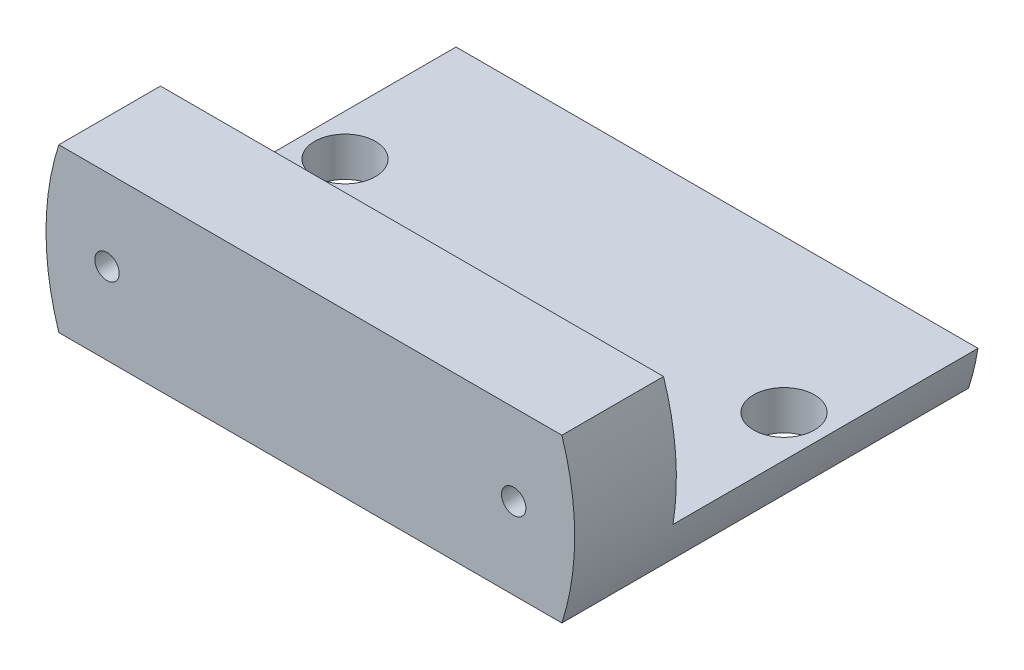
ISO-10303-21;
HEADER;
FILE_DESCRIPTION(('STEP AP214'),'2;1');
FILE_NAME('part.step','',(''),(''),'','','');
FILE_SCHEMA(('AUTOMOTIVE_DESIGN { 1 0 10303 214 1 1 1 1 }'));
ENDSEC;
DATA;
#1=APPLICATION_CONTEXT('core data for automotive mechanical design processes');
#2=APPLICATION_PROTOCOL_DEFINITION('international standard','automotive_design',2000,#1);
#3=PRODUCT_CONTEXT('',#1,'mechanical');
#4=PRODUCT('Part','Part','',(#3));
#5=PRODUCT_RELATED_PRODUCT_CATEGORY('part','',(#4));
#6=PRODUCT_DEFINITION_FORMATION('','',#4);
#7=PRODUCT_DEFINITION_CONTEXT('part definition',#1,'design');
#8=PRODUCT_DEFINITION('design','',#6,#7);
#9=PRODUCT_DEFINITION_SHAPE('','',#8);
#10=(LENGTH_UNIT() NAMED_UNIT(*) SI_UNIT(.MILLI.,.METRE.));
#11=(NAMED_UNIT(*) PLANE_ANGLE_UNIT() SI_UNIT($,.RADIAN.));
#12=(NAMED_UNIT(*) SI_UNIT($,.STERADIAN.) SOLID_ANGLE_UNIT());
#13=UNCERTAINTY_MEASURE_WITH_UNIT(LENGTH_MEASURE(1.E-05),#10,'distance_accuracy_value','');
#14=(GEOMETRIC_REPRESENTATION_CONTEXT(3) GLOBAL_UNCERTAINTY_ASSIGNED_CONTEXT((#13)) GLOBAL_UNIT_ASSIGNED_CONTEXT((#10,
#11,#12)) REPRESENTATION_CONTEXT('',''));
#15=CARTESIAN_POINT('',(0.,0.,0.));
#16=DIRECTION('',(0.,0.,1.));
#17=DIRECTION('',(1.,0.,0.));
#18=AXIS2_PLACEMENT_3D('',#15,#16,#17);
#19=CARTESIAN_POINT('',(0.,0.,0.));
#20=DIRECTION('',(0.,0.,1.));
#21=DIRECTION('',(1.,0.,0.));
#22=AXIS2_PLACEMENT_3D('',#19,#20,#21);
#23=PLANE('',#22);
#24=CARTESIAN_POINT('',(-10.,0.,0.));
#25=DIRECTION('',(0.,0.,1.));
#26=DIRECTION('',(-1.,0.,0.));
#27=AXIS2_PLACEMENT_3D('',#24,#25,#26);
#28=CIRCLE('',#27,0.6);
#29=CARTESIAN_POINT('',(-10.6,0.,0.));
#30=VERTEX_POINT('',#29);
#31=EDGE_CURVE('E114',#30,#30,#28,.T.);
#32=ORIENTED_EDGE('',*,*,#31,.T.);
#33=EDGE_LOOP('',(#32));
#34=FACE_BOUND('',#33,.T.);
#35=CARTESIAN_POINT('',(10.,0.,0.));
#36=DIRECTION('',(0.,0.,1.));
#37=DIRECTION('',(1.,0.,0.));
#38=AXIS2_PLACEMENT_3D('',#35,#36,#37);
#39=CIRCLE('',#38,0.6);
#40=CARTESIAN_POINT('',(10.6,0.,0.));
#41=VERTEX_POINT('',#40);
#42=EDGE_CURVE('E144',#41,#41,#39,.T.);
#43=ORIENTED_EDGE('',*,*,#42,.T.);
#44=EDGE_LOOP('',(#43));
#45=FACE_BOUND('',#44,.T.);
#46=DIRECTION('',(1.,0.,0.));
#47=VECTOR('',#46,1.);
#48=CARTESIAN_POINT('',(12.3275902603068,-2.06894136552694,0.));
#49=LINE('',#48,#47);
#50=CARTESIAN_POINT('',(-12.8343087708693,-2.06894136552694,0.));
#51=VERTEX_POINT('',#50);
#52=CARTESIAN_POINT('',(12.8343087708693,-2.06894136552694,0.));
#53=VERTEX_POINT('',#52);
#54=EDGE_CURVE('E50',#51,#53,#49,.T.);
#55=ORIENTED_EDGE('',*,*,#54,.F.);
#56=CARTESIAN_POINT('',(0.,0.,0.));
#57=DIRECTION('',(0.,0.,1.));
#58=DIRECTION('',(1.,0.,0.));
#59=AXIS2_PLACEMENT_3D('',#56,#57,#58);
#60=CIRCLE('',#59,13.);
#61=CARTESIAN_POINT('',(-12.369316876853,4.,0.));
#62=VERTEX_POINT('',#61);
#63=EDGE_CURVE('E139',#62,#51,#60,.T.);
#64=ORIENTED_EDGE('',*,*,#63,.F.);
#65=DIRECTION('',(-1.,0.,0.));
#66=VECTOR('',#65,1.);
#67=CARTESIAN_POINT('',(-11.842719282327,4.,0.));
#68=LINE('',#67,#66);
#69=CARTESIAN_POINT('',(12.369316876853,4.,0.));
#70=VERTEX_POINT('',#69);
#71=EDGE_CURVE('E74',#70,#62,#68,.T.);
#72=ORIENTED_EDGE('',*,*,#71,.F.);
#73=CARTESIAN_POINT('',(0.,0.,0.));
#74=DIRECTION('',(0.,0.,1.));
#75=DIRECTION('',(1.,0.,0.));
#76=AXIS2_PLACEMENT_3D('',#73,#74,#75);
#77=CIRCLE('',#76,13.);
#78=EDGE_CURVE('E132',#53,#70,#77,.T.);
#79=ORIENTED_EDGE('',*,*,#78,.F.);
#80=EDGE_LOOP('',(#55,#64,#72,#79));
#81=FACE_BOUND('',#80,.T.);
#82=ADVANCED_FACE('F33',(#34,#45,#81),#23,.F.);
#83=CARTESIAN_POINT('',(0.,0.,5.));
#84=DIRECTION('',(0.,0.,1.));
#85=DIRECTION('',(1.,0.,0.));
#86=AXIS2_PLACEMENT_3D('',#83,#84,#85);
#87=PLANE('',#86);
#88=CARTESIAN_POINT('',(10.,0.,5.));
#89=DIRECTION('',(0.,0.,1.));
#90=DIRECTION('',(1.,0.,0.));
#91=AXIS2_PLACEMENT_3D('',#88,#89,#90);
#92=CIRCLE('',#91,0.6);
#93=CARTESIAN_POINT('',(10.6,0.,5.));
#94=VERTEX_POINT('',#93);
#95=EDGE_CURVE('E142',#94,#94,#92,.T.);
#96=ORIENTED_EDGE('',*,*,#95,.F.);
#97=EDGE_LOOP('',(#96));
#98=FACE_BOUND('',#97,.T.);
#99=CARTESIAN_POINT('',(0.,0.,5.));
#100=DIRECTION('',(0.,0.,1.));
#101=DIRECTION('',(1.,0.,0.));
#102=AXIS2_PLACEMENT_3D('',#99,#100,#101);
#103=CIRCLE('',#102,13.);
#104=CARTESIAN_POINT('',(-12.369316876853,4.,5.));
#105=VERTEX_POINT('',#104);
#106=CARTESIAN_POINT('',(-12.369316876853,-3.99999999999999,5.));
#107=VERTEX_POINT('',#106);
#108=EDGE_CURVE('E154',#105,#107,#103,.T.);
#109=ORIENTED_EDGE('',*,*,#108,.T.);
#110=DIRECTION('',(1.,0.,0.));
#111=VECTOR('',#110,1.);
#112=CARTESIAN_POINT('',(-11.842719282327,-3.99999999999999,5.));
#113=LINE('',#112,#111);
#114=CARTESIAN_POINT('',(12.369316876853,-4.,5.));
#115=VERTEX_POINT('',#114);
#116=EDGE_CURVE('E81',#107,#115,#113,.T.);
#117=ORIENTED_EDGE('',*,*,#116,.T.);
#118=CARTESIAN_POINT('',(0.,0.,5.));
#119=DIRECTION('',(0.,0.,1.));
#120=DIRECTION('',(1.,0.,0.));
#121=AXIS2_PLACEMENT_3D('',#118,#119,#120);
#122=CIRCLE('',#121,13.);
#123=CARTESIAN_POINT('',(12.369316876853,4.,5.));
#124=VERTEX_POINT('',#123);
#125=EDGE_CURVE('E159',#115,#124,#122,.T.);
#126=ORIENTED_EDGE('',*,*,#125,.T.);
#127=DIRECTION('',(-1.,0.,0.));
#128=VECTOR('',#127,1.);
#129=CARTESIAN_POINT('',(11.842719282327,4.,5.));
#130=LINE('',#129,#128);
#131=EDGE_CURVE('E59',#124,#105,#130,.T.);
#132=ORIENTED_EDGE('',*,*,#131,.T.);
#133=EDGE_LOOP('',(#109,#117,#126,#132));
#134=FACE_BOUND('',#133,.T.);
#135=CARTESIAN_POINT('',(-10.,0.,5.));
#136=DIRECTION('',(0.,0.,1.));
#137=DIRECTION('',(-1.,0.,0.));
#138=AXIS2_PLACEMENT_3D('',#135,#136,#137);
#139=CIRCLE('',#138,0.6);
#140=CARTESIAN_POINT('',(-10.6,0.,5.));
#141=VERTEX_POINT('',#140);
#142=EDGE_CURVE('E127',#141,#141,#139,.T.);
#143=ORIENTED_EDGE('',*,*,#142,.F.);
#144=EDGE_LOOP('',(#143));
#145=FACE_BOUND('',#144,.T.);
#146=ADVANCED_FACE('F161',(#98,#134,#145),#87,.T.);
#147=CARTESIAN_POINT('',(0.,0.,5.));
#148=DIRECTION('',(0.,0.,-1.));
#149=DIRECTION('',(-1.,0.,0.));
#150=AXIS2_PLACEMENT_3D('',#147,#148,#149);
#151=CYLINDRICAL_SURFACE('',#150,13.);
#152=ORIENTED_EDGE('',*,*,#63,.T.);
#153=DIRECTION('',(0.,0.,1.));
#154=VECTOR('',#153,1.);
#155=CARTESIAN_POINT('',(-12.8343087708693,-2.06894136552695,-15.));
#156=LINE('',#155,#154);
#157=CARTESIAN_POINT('',(-12.8343087708693,-2.06894136552695,-15.));
#158=VERTEX_POINT('',#157);
#159=EDGE_CURVE('E115',#158,#51,#156,.T.);
#160=ORIENTED_EDGE('',*,*,#159,.F.);
#161=CARTESIAN_POINT('',(0.,0.,-15.));
#162=DIRECTION('',(0.,0.,-1.));
#163=DIRECTION('',(-1.,0.,0.));
#164=AXIS2_PLACEMENT_3D('',#161,#162,#163);
#165=CIRCLE('',#164,13.);
#166=CARTESIAN_POINT('',(-12.369316876853,-3.99999999999999,-15.));
#167=VERTEX_POINT('',#166);
#168=EDGE_CURVE('E105',#167,#158,#165,.T.);
#169=ORIENTED_EDGE('',*,*,#168,.F.);
#170=DIRECTION('',(0.,0.,-1.));
#171=VECTOR('',#170,1.);
#172=CARTESIAN_POINT('',(-12.369316876853,-3.99999999999999,5.));
#173=LINE('',#172,#171);
#174=EDGE_CURVE('E11',#107,#167,#173,.T.);
#175=ORIENTED_EDGE('',*,*,#174,.F.);
#176=ORIENTED_EDGE('',*,*,#108,.F.);
#177=DIRECTION('',(0.,0.,-1.));
#178=VECTOR('',#177,1.);
#179=CARTESIAN_POINT('',(-12.369316876853,4.,5.));
#180=LINE('',#179,#178);
#181=EDGE_CURVE('E141',#105,#62,#180,.T.);
#182=ORIENTED_EDGE('',*,*,#181,.T.);
#183=EDGE_LOOP('',(#152,#160,#169,#175,#176,#182));
#184=FACE_BOUND('',#183,.T.);
#185=ADVANCED_FACE('F35',(#184),#151,.T.);
#186=CARTESIAN_POINT('',(11.842719282327,-3.99999999999999,5.));
#187=DIRECTION('',(0.,1.,0.));
#188=DIRECTION('',(0.,0.,1.));
#189=AXIS2_PLACEMENT_3D('',#186,#187,#188);
#190=PLANE('',#189);
#191=CARTESIAN_POINT('',(10.795,-4.,-7.5));
#192=DIRECTION('',(0.,1.,0.));
#193=DIRECTION('',(0.,0.,-1.));
#194=AXIS2_PLACEMENT_3D('',#191,#192,#193);
#195=CIRCLE('',#194,1.5);
#196=CARTESIAN_POINT('',(10.795,-4.,-9.));
#197=VERTEX_POINT('',#196);
#198=EDGE_CURVE('E186',#197,#197,#195,.T.);
#199=ORIENTED_EDGE('',*,*,#198,.T.);
#200=EDGE_LOOP('',(#199));
#201=FACE_BOUND('',#200,.T.);
#202=CARTESIAN_POINT('',(-10.795,-4.,-7.5));
#203=DIRECTION('',(0.,1.,0.));
#204=DIRECTION('',(0.,0.,1.));
#205=AXIS2_PLACEMENT_3D('',#202,#203,#204);
#206=CIRCLE('',#205,1.5);
#207=CARTESIAN_POINT('',(-10.795,-4.,-6.));
#208=VERTEX_POINT('',#207);
#209=EDGE_CURVE('E131',#208,#208,#206,.T.);
#210=ORIENTED_EDGE('',*,*,#209,.T.);
#211=EDGE_LOOP('',(#210));
#212=FACE_BOUND('',#211,.T.);
#213=ORIENTED_EDGE('',*,*,#174,.T.);
#214=DIRECTION('',(-1.,0.,0.));
#215=VECTOR('',#214,1.);
#216=CARTESIAN_POINT('',(11.842719282327,-3.99999999999999,-15.));
#217=LINE('',#216,#215);
#218=CARTESIAN_POINT('',(12.369316876853,-3.99999999999999,-15.));
#219=VERTEX_POINT('',#218);
#220=EDGE_CURVE('E119',#219,#167,#217,.T.);
#221=ORIENTED_EDGE('',*,*,#220,.F.);
#222=DIRECTION('',(0.,0.,-1.));
#223=VECTOR('',#222,1.);
#224=CARTESIAN_POINT('',(12.369316876853,-4.,5.));
#225=LINE('',#224,#223);
#226=EDGE_CURVE('E42',#115,#219,#225,.T.);
#227=ORIENTED_EDGE('',*,*,#226,.F.);
#228=ORIENTED_EDGE('',*,*,#116,.F.);
#229=EDGE_LOOP('',(#213,#221,#227,#228));
#230=FACE_BOUND('',#229,.T.);
#231=ADVANCED_FACE('F177',(#201,#212,#230),#190,.F.);
#232=CARTESIAN_POINT('',(0.,0.,5.));
#233=DIRECTION('',(0.,0.,-1.));
#234=DIRECTION('',(-1.,0.,0.));
#235=AXIS2_PLACEMENT_3D('',#232,#233,#234);
#236=CYLINDRICAL_SURFACE('',#235,13.);
#237=ORIENTED_EDGE('',*,*,#226,.T.);
#238=CARTESIAN_POINT('',(0.,0.,-15.));
#239=DIRECTION('',(0.,0.,-1.));
#240=DIRECTION('',(-1.,0.,0.));
#241=AXIS2_PLACEMENT_3D('',#238,#239,#240);
#242=CIRCLE('',#241,13.);
#243=CARTESIAN_POINT('',(12.8343087708693,-2.06894136552694,-15.));
#244=VERTEX_POINT('',#243);
#245=EDGE_CURVE('E102',#244,#219,#242,.T.);
#246=ORIENTED_EDGE('',*,*,#245,.F.);
#247=DIRECTION('',(0.,0.,1.));
#248=VECTOR('',#247,1.);
#249=CARTESIAN_POINT('',(12.8343087708693,-2.06894136552694,-15.));
#250=LINE('',#249,#248);
#251=EDGE_CURVE('E111',#244,#53,#250,.T.);
#252=ORIENTED_EDGE('',*,*,#251,.T.);
#253=ORIENTED_EDGE('',*,*,#78,.T.);
#254=DIRECTION('',(0.,0.,-1.));
#255=VECTOR('',#254,1.);
#256=CARTESIAN_POINT('',(12.369316876853,4.,5.));
#257=LINE('',#256,#255);
#258=EDGE_CURVE('E156',#124,#70,#257,.T.);
#259=ORIENTED_EDGE('',*,*,#258,.F.);
#260=ORIENTED_EDGE('',*,*,#125,.F.);
#261=EDGE_LOOP('',(#237,#246,#252,#253,#259,#260));
#262=FACE_BOUND('',#261,.T.);
#263=ADVANCED_FACE('F117',(#262),#236,.T.);
#264=CARTESIAN_POINT('',(-11.842719282327,4.,5.));
#265=DIRECTION('',(0.,-1.,0.));
#266=DIRECTION('',(0.,0.,-1.));
#267=AXIS2_PLACEMENT_3D('',#264,#265,#266);
#268=PLANE('',#267);
#269=ORIENTED_EDGE('',*,*,#71,.T.);
#270=ORIENTED_EDGE('',*,*,#181,.F.);
#271=ORIENTED_EDGE('',*,*,#131,.F.);
#272=ORIENTED_EDGE('',*,*,#258,.T.);
#273=EDGE_LOOP('',(#269,#270,#271,#272));
#274=FACE_BOUND('',#273,.T.);
#275=ADVANCED_FACE('F158',(#274),#268,.F.);
#276=CARTESIAN_POINT('',(10.,0.,5.));
#277=DIRECTION('',(0.,0.,-1.));
#278=DIRECTION('',(-1.,0.,0.));
#279=AXIS2_PLACEMENT_3D('',#276,#277,#278);
#280=CYLINDRICAL_SURFACE('',#279,0.6);
#281=ORIENTED_EDGE('',*,*,#95,.T.);
#282=EDGE_LOOP('',(#281));
#283=FACE_BOUND('',#282,.T.);
#284=ORIENTED_EDGE('',*,*,#42,.F.);
#285=EDGE_LOOP('',(#284));
#286=FACE_BOUND('',#285,.T.);
#287=ADVANCED_FACE('F175',(#283,#286),#280,.F.);
#288=CARTESIAN_POINT('',(-10.,0.,5.));
#289=DIRECTION('',(0.,0.,-1.));
#290=DIRECTION('',(-1.,0.,0.));
#291=AXIS2_PLACEMENT_3D('',#288,#289,#290);
#292=CYLINDRICAL_SURFACE('',#291,0.6);
#293=ORIENTED_EDGE('',*,*,#142,.T.);
#294=EDGE_LOOP('',(#293));
#295=FACE_BOUND('',#294,.T.);
#296=ORIENTED_EDGE('',*,*,#31,.F.);
#297=EDGE_LOOP('',(#296));
#298=FACE_BOUND('',#297,.T.);
#299=ADVANCED_FACE('F199',(#295,#298),#292,.F.);
#300=CARTESIAN_POINT('',(12.3275902603068,-2.06894136552694,-15.));
#301=DIRECTION('',(0.,-1.,0.));
#302=DIRECTION('',(0.,0.,-1.));
#303=AXIS2_PLACEMENT_3D('',#300,#301,#302);
#304=PLANE('',#303);
#305=CARTESIAN_POINT('',(10.795,-2.06894136552694,-7.5));
#306=DIRECTION('',(0.,1.,0.));
#307=DIRECTION('',(0.,0.,-1.));
#308=AXIS2_PLACEMENT_3D('',#305,#306,#307);
#309=CIRCLE('',#308,1.5);
#310=CARTESIAN_POINT('',(10.795,-2.06894136552694,-9.));
#311=VERTEX_POINT('',#310);
#312=EDGE_CURVE('E224',#311,#311,#309,.T.);
#313=ORIENTED_EDGE('',*,*,#312,.F.);
#314=EDGE_LOOP('',(#313));
#315=FACE_BOUND('',#314,.T.);
#316=CARTESIAN_POINT('',(-10.795,-2.06894136552694,-7.5));
#317=DIRECTION('',(0.,1.,0.));
#318=DIRECTION('',(0.,0.,1.));
#319=AXIS2_PLACEMENT_3D('',#316,#317,#318);
#320=CIRCLE('',#319,1.5);
#321=CARTESIAN_POINT('',(-10.795,-2.06894136552694,-6.));
#322=VERTEX_POINT('',#321);
#323=EDGE_CURVE('E226',#322,#322,#320,.T.);
#324=ORIENTED_EDGE('',*,*,#323,.F.);
#325=EDGE_LOOP('',(#324));
#326=FACE_BOUND('',#325,.T.);
#327=ORIENTED_EDGE('',*,*,#54,.T.);
#328=ORIENTED_EDGE('',*,*,#251,.F.);
#329=DIRECTION('',(1.,0.,0.));
#330=VECTOR('',#329,1.);
#331=CARTESIAN_POINT('',(-12.3275902603068,-2.06894136552694,-15.));
#332=LINE('',#331,#330);
#333=EDGE_CURVE('E97',#158,#244,#332,.T.);
#334=ORIENTED_EDGE('',*,*,#333,.F.);
#335=ORIENTED_EDGE('',*,*,#159,.T.);
#336=EDGE_LOOP('',(#327,#328,#334,#335));
#337=FACE_BOUND('',#336,.T.);
#338=ADVANCED_FACE('F112',(#315,#326,#337),#304,.F.);
#339=CARTESIAN_POINT('',(0.,0.,-15.));
#340=DIRECTION('',(0.,0.,-1.));
#341=DIRECTION('',(-1.,0.,0.));
#342=AXIS2_PLACEMENT_3D('',#339,#340,#341);
#343=PLANE('',#342);
#344=ORIENTED_EDGE('',*,*,#333,.T.);
#345=ORIENTED_EDGE('',*,*,#245,.T.);
#346=ORIENTED_EDGE('',*,*,#220,.T.);
#347=ORIENTED_EDGE('',*,*,#168,.T.);
#348=EDGE_LOOP('',(#344,#345,#346,#347));
#349=FACE_BOUND('',#348,.T.);
#350=ADVANCED_FACE('F99',(#349),#343,.T.);
#351=CARTESIAN_POINT('',(-10.795,-4.,-7.5));
#352=DIRECTION('',(0.,1.,0.));
#353=DIRECTION('',(0.,0.,1.));
#354=AXIS2_PLACEMENT_3D('',#351,#352,#353);
#355=CYLINDRICAL_SURFACE('',#354,1.5);
#356=ORIENTED_EDGE('',*,*,#209,.F.);
#357=EDGE_LOOP('',(#356));
#358=FACE_BOUND('',#357,.T.);
#359=ORIENTED_EDGE('',*,*,#323,.T.);
#360=EDGE_LOOP('',(#359));
#361=FACE_BOUND('',#360,.T.);
#362=ADVANCED_FACE('F212',(#358,#361),#355,.F.);
#363=CARTESIAN_POINT('',(10.795,-4.,-7.5));
#364=DIRECTION('',(0.,1.,0.));
#365=DIRECTION('',(0.,0.,1.));
#366=AXIS2_PLACEMENT_3D('',#363,#364,#365);
#367=CYLINDRICAL_SURFACE('',#366,1.5);
#368=ORIENTED_EDGE('',*,*,#198,.F.);
#369=EDGE_LOOP('',(#368));
#370=FACE_BOUND('',#369,.T.);
#371=ORIENTED_EDGE('',*,*,#312,.T.);
#372=EDGE_LOOP('',(#371));
#373=FACE_BOUND('',#372,.T.);
#374=ADVANCED_FACE('F215',(#370,#373),#367,.F.);
#375=CLOSED_SHELL('',(#82,#146,#185,#231,#263,#275,#287,#299,#338,#350,#362,#374));
#376=MANIFOLD_SOLID_BREP('B2',#375);
#377=ADVANCED_BREP_SHAPE_REPRESENTATION('',(#18,#376),#14);
#378=SHAPE_DEFINITION_REPRESENTATION(#9,#377);
ENDSEC;
END-ISO-10303-21;
